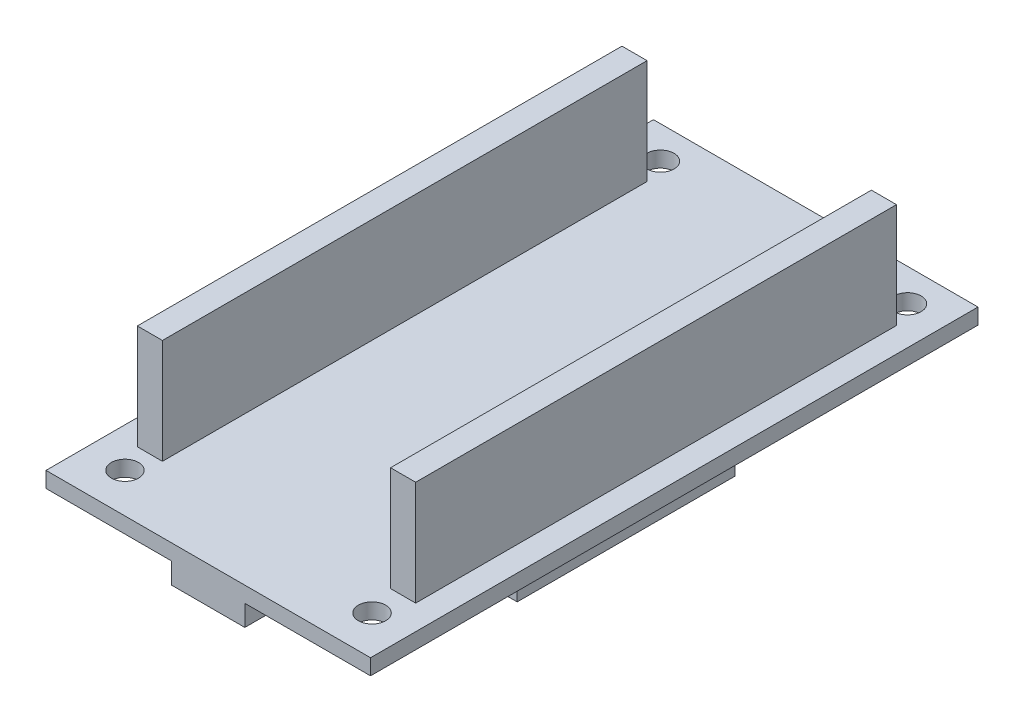
ISO-10303-21;
HEADER;
FILE_DESCRIPTION(('STEP AP214'),'2;1');
FILE_NAME('part.step','',(''),(''),'','','');
FILE_SCHEMA(('AUTOMOTIVE_DESIGN { 1 0 10303 214 1 1 1 1 }'));
ENDSEC;
DATA;
#1=APPLICATION_CONTEXT('core data for automotive mechanical design processes');
#2=APPLICATION_PROTOCOL_DEFINITION('international standard','automotive_design',2000,#1);
#3=PRODUCT_CONTEXT('',#1,'mechanical');
#4=PRODUCT('Part','Part','',(#3));
#5=PRODUCT_RELATED_PRODUCT_CATEGORY('part','',(#4));
#6=PRODUCT_DEFINITION_FORMATION('','',#4);
#7=PRODUCT_DEFINITION_CONTEXT('part definition',#1,'design');
#8=PRODUCT_DEFINITION('design','',#6,#7);
#9=PRODUCT_DEFINITION_SHAPE('','',#8);
#10=(LENGTH_UNIT() NAMED_UNIT(*) SI_UNIT(.MILLI.,.METRE.));
#11=(NAMED_UNIT(*) PLANE_ANGLE_UNIT() SI_UNIT($,.RADIAN.));
#12=(NAMED_UNIT(*) SI_UNIT($,.STERADIAN.) SOLID_ANGLE_UNIT());
#13=UNCERTAINTY_MEASURE_WITH_UNIT(LENGTH_MEASURE(1.E-05),#10,'distance_accuracy_value','');
#14=(GEOMETRIC_REPRESENTATION_CONTEXT(3) GLOBAL_UNCERTAINTY_ASSIGNED_CONTEXT((#13)) GLOBAL_UNIT_ASSIGNED_CONTEXT((#10,
#11,#12)) REPRESENTATION_CONTEXT('',''));
#15=CARTESIAN_POINT('',(0.,0.,0.));
#16=DIRECTION('',(0.,0.,1.));
#17=DIRECTION('',(1.,0.,0.));
#18=AXIS2_PLACEMENT_3D('',#15,#16,#17);
#19=CARTESIAN_POINT('',(0.,0.,0.));
#20=DIRECTION('',(0.,1.,0.));
#21=DIRECTION('',(0.,0.,1.));
#22=AXIS2_PLACEMENT_3D('',#19,#20,#21);
#23=PLANE('',#22);
#24=DIRECTION('',(0.,0.,-1.));
#25=VECTOR('',#24,1.);
#26=CARTESIAN_POINT('',(8.24109850979762,0.,3.777498206116));
#27=LINE('',#26,#25);
#28=CARTESIAN_POINT('',(8.24109850979762,0.,3.777498206116));
#29=VERTEX_POINT('',#28);
#30=CARTESIAN_POINT('',(8.24109850979762,0.,-3.62603920152593));
#31=VERTEX_POINT('',#30);
#32=EDGE_CURVE('E254',#29,#31,#27,.T.);
#33=ORIENTED_EDGE('',*,*,#32,.F.);
#34=DIRECTION('',(1.,0.,0.));
#35=VECTOR('',#34,1.);
#36=CARTESIAN_POINT('',(-3.76660419216143,0.,3.777498206116));
#37=LINE('',#36,#35);
#38=CARTESIAN_POINT('',(-3.76660419216143,0.,3.777498206116));
#39=VERTEX_POINT('',#38);
#40=EDGE_CURVE('E323',#39,#29,#37,.T.);
#41=ORIENTED_EDGE('',*,*,#40,.F.);
#42=DIRECTION('',(0.,0.,1.));
#43=VECTOR('',#42,1.);
#44=CARTESIAN_POINT('',(-3.76660419216143,0.,-54.248248197674));
#45=LINE('',#44,#43);
#46=CARTESIAN_POINT('',(-3.76660419216143,0.,-54.248248197674));
#47=VERTEX_POINT('',#46);
#48=EDGE_CURVE('E306',#47,#39,#45,.T.);
#49=ORIENTED_EDGE('',*,*,#48,.F.);
#50=DIRECTION('',(-1.,0.,0.));
#51=VECTOR('',#50,1.);
#52=CARTESIAN_POINT('',(-3.76660419216143,0.,-54.248248197674));
#53=LINE('',#52,#51);
#54=CARTESIAN_POINT('',(27.2346902260629,0.,-54.248248197674));
#55=VERTEX_POINT('',#54);
#56=EDGE_CURVE('E313',#55,#47,#53,.T.);
#57=ORIENTED_EDGE('',*,*,#56,.F.);
#58=DIRECTION('',(0.,0.,-1.));
#59=VECTOR('',#58,1.);
#60=CARTESIAN_POINT('',(27.2346902260629,0.,-54.248248197674));
#61=LINE('',#60,#59);
#62=CARTESIAN_POINT('',(27.2346902260629,0.,3.777498206116));
#63=VERTEX_POINT('',#62);
#64=EDGE_CURVE('E326',#63,#55,#61,.T.);
#65=ORIENTED_EDGE('',*,*,#64,.F.);
#66=CARTESIAN_POINT('',(15.2269875241038,0.,3.777498206116));
#67=VERTEX_POINT('',#66);
#68=EDGE_CURVE('E322',#67,#63,#37,.T.);
#69=ORIENTED_EDGE('',*,*,#68,.F.);
#70=DIRECTION('',(0.,0.,1.));
#71=VECTOR('',#70,1.);
#72=CARTESIAN_POINT('',(15.2269875241038,0.,3.777498206116));
#73=LINE('',#72,#71);
#74=CARTESIAN_POINT('',(15.2269875241038,0.,-3.62603920152593));
#75=VERTEX_POINT('',#74);
#76=EDGE_CURVE('E259',#75,#67,#73,.T.);
#77=ORIENTED_EDGE('',*,*,#76,.F.);
#78=DIRECTION('',(1.,0.,0.));
#79=VECTOR('',#78,1.);
#80=CARTESIAN_POINT('',(8.24109850979762,0.,-3.62603920152593));
#81=LINE('',#80,#79);
#82=EDGE_CURVE('E268',#31,#75,#81,.T.);
#83=ORIENTED_EDGE('',*,*,#82,.F.);
#84=EDGE_LOOP('',(#33,#41,#49,#57,#65,#69,#77,#83));
#85=FACE_BOUND('',#84,.T.);
#86=CARTESIAN_POINT('',(0.,0.,0.));
#87=DIRECTION('',(0.,1.,0.));
#88=DIRECTION('',(0.,0.,1.));
#89=AXIS2_PLACEMENT_3D('',#86,#87,#88);
#90=CIRCLE('',#89,1.3);
#91=CARTESIAN_POINT('',(0.,0.,1.3));
#92=VERTEX_POINT('',#91);
#93=EDGE_CURVE('E300',#92,#92,#90,.T.);
#94=ORIENTED_EDGE('',*,*,#93,.T.);
#95=EDGE_LOOP('',(#94));
#96=FACE_BOUND('',#95,.T.);
#97=CARTESIAN_POINT('',(23.6,0.,0.));
#98=DIRECTION('',(0.,1.,0.));
#99=DIRECTION('',(0.,0.,1.));
#100=AXIS2_PLACEMENT_3D('',#97,#98,#99);
#101=CIRCLE('',#100,1.3);
#102=CARTESIAN_POINT('',(23.6,0.,1.3));
#103=VERTEX_POINT('',#102);
#104=EDGE_CURVE('E294',#103,#103,#101,.T.);
#105=ORIENTED_EDGE('',*,*,#104,.T.);
#106=EDGE_LOOP('',(#105));
#107=FACE_BOUND('',#106,.T.);
#108=CARTESIAN_POINT('',(23.5999999999998,0.,-51.15));
#109=DIRECTION('',(0.,1.,0.));
#110=DIRECTION('',(0.,0.,1.));
#111=AXIS2_PLACEMENT_3D('',#108,#109,#110);
#112=CIRCLE('',#111,1.3);
#113=CARTESIAN_POINT('',(23.5999999999998,0.,-49.85));
#114=VERTEX_POINT('',#113);
#115=EDGE_CURVE('E288',#114,#114,#112,.T.);
#116=ORIENTED_EDGE('',*,*,#115,.T.);
#117=EDGE_LOOP('',(#116));
#118=FACE_BOUND('',#117,.T.);
#119=CARTESIAN_POINT('',(-1.75457236293007E-13,0.,-51.15));
#120=DIRECTION('',(0.,1.,0.));
#121=DIRECTION('',(0.,0.,1.));
#122=AXIS2_PLACEMENT_3D('',#119,#120,#121);
#123=CIRCLE('',#122,1.3);
#124=CARTESIAN_POINT('',(-1.75457236293007E-13,0.,-49.85));
#125=VERTEX_POINT('',#124);
#126=EDGE_CURVE('E284',#125,#125,#123,.T.);
#127=ORIENTED_EDGE('',*,*,#126,.T.);
#128=EDGE_LOOP('',(#127));
#129=FACE_BOUND('',#128,.T.);
#130=DIRECTION('',(0.,0.,1.));
#131=VECTOR('',#130,1.);
#132=CARTESIAN_POINT('',(26.1228890464172,0.,-11.3417972173268));
#133=LINE('',#132,#131);
#134=CARTESIAN_POINT('',(26.1228890464172,0.,-32.143063759925));
#135=VERTEX_POINT('',#134);
#136=CARTESIAN_POINT('',(26.1228890464172,0.,-11.3417972173268));
#137=VERTEX_POINT('',#136);
#138=EDGE_CURVE('E190',#135,#137,#133,.T.);
#139=ORIENTED_EDGE('',*,*,#138,.F.);
#140=DIRECTION('',(1.,0.,0.));
#141=VECTOR('',#140,1.);
#142=CARTESIAN_POINT('',(26.1228890464172,0.,-32.143063759925));
#143=LINE('',#142,#141);
#144=CARTESIAN_POINT('',(24.4546170430008,0.,-32.143063759925));
#145=VERTEX_POINT('',#144);
#146=EDGE_CURVE('E187',#145,#135,#143,.T.);
#147=ORIENTED_EDGE('',*,*,#146,.F.);
#148=DIRECTION('',(0.,0.,-1.));
#149=VECTOR('',#148,1.);
#150=CARTESIAN_POINT('',(24.4546170430008,0.,-11.3417972173268));
#151=LINE('',#150,#149);
#152=CARTESIAN_POINT('',(24.4546170430008,0.,-11.3417972173268));
#153=VERTEX_POINT('',#152);
#154=EDGE_CURVE('E53',#153,#145,#151,.T.);
#155=ORIENTED_EDGE('',*,*,#154,.F.);
#156=DIRECTION('',(-1.,0.,0.));
#157=VECTOR('',#156,1.);
#158=CARTESIAN_POINT('',(26.1228890464172,0.,-11.3417972173268));
#159=LINE('',#158,#157);
#160=EDGE_CURVE('E48',#137,#153,#159,.T.);
#161=ORIENTED_EDGE('',*,*,#160,.F.);
#162=EDGE_LOOP('',(#139,#147,#155,#161));
#163=FACE_BOUND('',#162,.T.);
#164=ADVANCED_FACE('F33',(#85,#96,#107,#118,#129,#163),#23,.F.);
#165=CARTESIAN_POINT('',(0.,1.5,0.));
#166=DIRECTION('',(0.,1.,0.));
#167=DIRECTION('',(0.,0.,1.));
#168=AXIS2_PLACEMENT_3D('',#165,#166,#167);
#169=PLANE('',#168);
#170=CARTESIAN_POINT('',(23.5999999999998,1.5,-51.15));
#171=DIRECTION('',(0.,1.,0.));
#172=DIRECTION('',(0.,0.,1.));
#173=AXIS2_PLACEMENT_3D('',#170,#171,#172);
#174=CIRCLE('',#173,1.3);
#175=CARTESIAN_POINT('',(23.5999999999998,1.5,-49.85));
#176=VERTEX_POINT('',#175);
#177=EDGE_CURVE('E291',#176,#176,#174,.T.);
#178=ORIENTED_EDGE('',*,*,#177,.F.);
#179=EDGE_LOOP('',(#178));
#180=FACE_BOUND('',#179,.T.);
#181=CARTESIAN_POINT('',(0.,1.5,0.));
#182=DIRECTION('',(0.,1.,0.));
#183=DIRECTION('',(0.,0.,1.));
#184=AXIS2_PLACEMENT_3D('',#181,#182,#183);
#185=CIRCLE('',#184,1.3);
#186=CARTESIAN_POINT('',(0.,1.5,1.3));
#187=VERTEX_POINT('',#186);
#188=EDGE_CURVE('E303',#187,#187,#185,.T.);
#189=ORIENTED_EDGE('',*,*,#188,.F.);
#190=EDGE_LOOP('',(#189));
#191=FACE_BOUND('',#190,.T.);
#192=DIRECTION('',(0.,0.,1.));
#193=VECTOR('',#192,1.);
#194=CARTESIAN_POINT('',(-3.76660419216143,1.5,-54.248248197674));
#195=LINE('',#194,#193);
#196=CARTESIAN_POINT('',(-3.76660419216143,1.5,-54.248248197674));
#197=VERTEX_POINT('',#196);
#198=CARTESIAN_POINT('',(-3.76660419216143,1.5,3.777498206116));
#199=VERTEX_POINT('',#198);
#200=EDGE_CURVE('E309',#197,#199,#195,.T.);
#201=ORIENTED_EDGE('',*,*,#200,.T.);
#202=DIRECTION('',(1.,0.,0.));
#203=VECTOR('',#202,1.);
#204=CARTESIAN_POINT('',(-3.76660419216143,1.5,3.777498206116));
#205=LINE('',#204,#203);
#206=CARTESIAN_POINT('',(27.2346902260629,1.5,3.777498206116));
#207=VERTEX_POINT('',#206);
#208=EDGE_CURVE('E312',#199,#207,#205,.T.);
#209=ORIENTED_EDGE('',*,*,#208,.T.);
#210=DIRECTION('',(0.,0.,-1.));
#211=VECTOR('',#210,1.);
#212=CARTESIAN_POINT('',(27.2346902260629,1.5,-54.248248197674));
#213=LINE('',#212,#211);
#214=CARTESIAN_POINT('',(27.2346902260629,1.5,-54.248248197674));
#215=VERTEX_POINT('',#214);
#216=EDGE_CURVE('E315',#207,#215,#213,.T.);
#217=ORIENTED_EDGE('',*,*,#216,.T.);
#218=DIRECTION('',(-1.,0.,0.));
#219=VECTOR('',#218,1.);
#220=CARTESIAN_POINT('',(-3.76660419216143,1.5,-54.248248197674));
#221=LINE('',#220,#219);
#222=EDGE_CURVE('E317',#215,#197,#221,.T.);
#223=ORIENTED_EDGE('',*,*,#222,.T.);
#224=EDGE_LOOP('',(#201,#209,#217,#223));
#225=FACE_BOUND('',#224,.T.);
#226=CARTESIAN_POINT('',(23.6,1.5,0.));
#227=DIRECTION('',(0.,1.,0.));
#228=DIRECTION('',(0.,0.,1.));
#229=AXIS2_PLACEMENT_3D('',#226,#227,#228);
#230=CIRCLE('',#229,1.3);
#231=CARTESIAN_POINT('',(23.6,1.5,1.3));
#232=VERTEX_POINT('',#231);
#233=EDGE_CURVE('E297',#232,#232,#230,.T.);
#234=ORIENTED_EDGE('',*,*,#233,.F.);
#235=EDGE_LOOP('',(#234));
#236=FACE_BOUND('',#235,.T.);
#237=CARTESIAN_POINT('',(-1.75457236293007E-13,1.5,-51.15));
#238=DIRECTION('',(0.,1.,0.));
#239=DIRECTION('',(0.,0.,1.));
#240=AXIS2_PLACEMENT_3D('',#237,#238,#239);
#241=CIRCLE('',#240,1.3);
#242=CARTESIAN_POINT('',(-1.75457236293007E-13,1.5,-49.85));
#243=VERTEX_POINT('',#242);
#244=EDGE_CURVE('E285',#243,#243,#241,.T.);
#245=ORIENTED_EDGE('',*,*,#244,.F.);
#246=EDGE_LOOP('',(#245));
#247=FACE_BOUND('',#246,.T.);
#248=DIRECTION('',(1.,0.,0.));
#249=VECTOR('',#248,1.);
#250=CARTESIAN_POINT('',(-1.35146550984669,1.5,-2.53123569928394));
#251=LINE('',#250,#249);
#252=CARTESIAN_POINT('',(-1.35146550984669,1.5,-2.53123569928394));
#253=VERTEX_POINT('',#252);
#254=CARTESIAN_POINT('',(1.04667549506438,1.5,-2.53123569928394));
#255=VERTEX_POINT('',#254);
#256=EDGE_CURVE('E239',#253,#255,#251,.T.);
#257=ORIENTED_EDGE('',*,*,#256,.F.);
#258=DIRECTION('',(0.,0.,1.));
#259=VECTOR('',#258,1.);
#260=CARTESIAN_POINT('',(-1.35146550984669,1.5,-48.8257837940891));
#261=LINE('',#260,#259);
#262=CARTESIAN_POINT('',(-1.35146550984669,1.5,-48.8257837940891));
#263=VERTEX_POINT('',#262);
#264=EDGE_CURVE('E225',#263,#253,#261,.T.);
#265=ORIENTED_EDGE('',*,*,#264,.F.);
#266=DIRECTION('',(-1.,0.,0.));
#267=VECTOR('',#266,1.);
#268=CARTESIAN_POINT('',(-1.35146550984669,1.5,-48.8257837940891));
#269=LINE('',#268,#267);
#270=CARTESIAN_POINT('',(1.04667549506438,1.5,-48.8257837940891));
#271=VERTEX_POINT('',#270);
#272=EDGE_CURVE('E230',#271,#263,#269,.T.);
#273=ORIENTED_EDGE('',*,*,#272,.F.);
#274=DIRECTION('',(0.,0.,-1.));
#275=VECTOR('',#274,1.);
#276=CARTESIAN_POINT('',(1.04667549506438,1.5,-48.8257837940891));
#277=LINE('',#276,#275);
#278=EDGE_CURVE('E241',#255,#271,#277,.T.);
#279=ORIENTED_EDGE('',*,*,#278,.F.);
#280=EDGE_LOOP('',(#257,#265,#273,#279));
#281=FACE_BOUND('',#280,.T.);
#282=DIRECTION('',(1.,0.,0.));
#283=VECTOR('',#282,1.);
#284=CARTESIAN_POINT('',(22.4735440389438,1.5,-2.89617020003128));
#285=LINE('',#284,#283);
#286=CARTESIAN_POINT('',(22.4735440389438,1.5,-2.89617020003128));
#287=VERTEX_POINT('',#286);
#288=CARTESIAN_POINT('',(24.8716850438549,1.5,-2.89617020003128));
#289=VERTEX_POINT('',#288);
#290=EDGE_CURVE('E194',#287,#289,#285,.T.);
#291=ORIENTED_EDGE('',*,*,#290,.F.);
#292=DIRECTION('',(0.,0.,1.));
#293=VECTOR('',#292,1.);
#294=CARTESIAN_POINT('',(22.4735440389438,1.5,-48.8257837940891));
#295=LINE('',#294,#293);
#296=CARTESIAN_POINT('',(22.4735440389438,1.5,-48.8257837940891));
#297=VERTEX_POINT('',#296);
#298=EDGE_CURVE('E191',#297,#287,#295,.T.);
#299=ORIENTED_EDGE('',*,*,#298,.F.);
#300=DIRECTION('',(-1.,0.,0.));
#301=VECTOR('',#300,1.);
#302=CARTESIAN_POINT('',(22.4735440389438,1.5,-48.8257837940891));
#303=LINE('',#302,#301);
#304=CARTESIAN_POINT('',(24.8716850438549,1.5,-48.8257837940891));
#305=VERTEX_POINT('',#304);
#306=EDGE_CURVE('E204',#305,#297,#303,.T.);
#307=ORIENTED_EDGE('',*,*,#306,.F.);
#308=DIRECTION('',(0.,0.,-1.));
#309=VECTOR('',#308,1.);
#310=CARTESIAN_POINT('',(24.8716850438549,1.5,-48.8257837940891));
#311=LINE('',#310,#309);
#312=EDGE_CURVE('E212',#289,#305,#311,.T.);
#313=ORIENTED_EDGE('',*,*,#312,.F.);
#314=EDGE_LOOP('',(#291,#299,#307,#313));
#315=FACE_BOUND('',#314,.T.);
#316=ADVANCED_FACE('F353',(#180,#191,#225,#236,#247,#281,#315),#169,.T.);
#317=CARTESIAN_POINT('',(-3.76660419216143,1.5,-54.248248197674));
#318=DIRECTION('',(1.,0.,0.));
#319=DIRECTION('',(0.,0.,-1.));
#320=AXIS2_PLACEMENT_3D('',#317,#318,#319);
#321=PLANE('',#320);
#322=ORIENTED_EDGE('',*,*,#48,.T.);
#323=DIRECTION('',(0.,-1.,0.));
#324=VECTOR('',#323,1.);
#325=CARTESIAN_POINT('',(-3.76660419216143,1.5,3.777498206116));
#326=LINE('',#325,#324);
#327=EDGE_CURVE('E11',#199,#39,#326,.T.);
#328=ORIENTED_EDGE('',*,*,#327,.F.);
#329=ORIENTED_EDGE('',*,*,#200,.F.);
#330=DIRECTION('',(0.,-1.,0.));
#331=VECTOR('',#330,1.);
#332=CARTESIAN_POINT('',(-3.76660419216143,1.5,-54.248248197674));
#333=LINE('',#332,#331);
#334=EDGE_CURVE('E319',#197,#47,#333,.T.);
#335=ORIENTED_EDGE('',*,*,#334,.T.);
#336=EDGE_LOOP('',(#322,#328,#329,#335));
#337=FACE_BOUND('',#336,.T.);
#338=ADVANCED_FACE('F35',(#337),#321,.F.);
#339=CARTESIAN_POINT('',(-3.76660419216143,1.5,3.777498206116));
#340=DIRECTION('',(0.,0.,-1.));
#341=DIRECTION('',(-1.,0.,0.));
#342=AXIS2_PLACEMENT_3D('',#339,#340,#341);
#343=PLANE('',#342);
#344=ORIENTED_EDGE('',*,*,#40,.T.);
#345=DIRECTION('',(0.,1.,0.));
#346=VECTOR('',#345,1.);
#347=CARTESIAN_POINT('',(8.24109850979762,-2.,3.777498206116));
#348=LINE('',#347,#346);
#349=CARTESIAN_POINT('',(8.24109850979762,-2.,3.777498206116));
#350=VERTEX_POINT('',#349);
#351=EDGE_CURVE('E265',#350,#29,#348,.T.);
#352=ORIENTED_EDGE('',*,*,#351,.F.);
#353=DIRECTION('',(-1.,0.,0.));
#354=VECTOR('',#353,1.);
#355=CARTESIAN_POINT('',(8.24109850979762,-2.,3.777498206116));
#356=LINE('',#355,#354);
#357=CARTESIAN_POINT('',(15.2269875241038,-2.,3.777498206116));
#358=VERTEX_POINT('',#357);
#359=EDGE_CURVE('E263',#358,#350,#356,.T.);
#360=ORIENTED_EDGE('',*,*,#359,.F.);
#361=DIRECTION('',(0.,1.,0.));
#362=VECTOR('',#361,1.);
#363=CARTESIAN_POINT('',(15.2269875241038,-2.,3.777498206116));
#364=LINE('',#363,#362);
#365=EDGE_CURVE('E275',#358,#67,#364,.T.);
#366=ORIENTED_EDGE('',*,*,#365,.T.);
#367=ORIENTED_EDGE('',*,*,#68,.T.);
#368=DIRECTION('',(0.,-1.,0.));
#369=VECTOR('',#368,1.);
#370=CARTESIAN_POINT('',(27.2346902260629,1.5,3.777498206116));
#371=LINE('',#370,#369);
#372=EDGE_CURVE('E41',#207,#63,#371,.T.);
#373=ORIENTED_EDGE('',*,*,#372,.F.);
#374=ORIENTED_EDGE('',*,*,#208,.F.);
#375=ORIENTED_EDGE('',*,*,#327,.T.);
#376=EDGE_LOOP('',(#344,#352,#360,#366,#367,#373,#374,#375));
#377=FACE_BOUND('',#376,.T.);
#378=ADVANCED_FACE('F355',(#377),#343,.F.);
#379=CARTESIAN_POINT('',(27.2346902260629,1.5,-54.248248197674));
#380=DIRECTION('',(-1.,0.,0.));
#381=DIRECTION('',(0.,0.,1.));
#382=AXIS2_PLACEMENT_3D('',#379,#380,#381);
#383=PLANE('',#382);
#384=ORIENTED_EDGE('',*,*,#64,.T.);
#385=DIRECTION('',(0.,-1.,0.));
#386=VECTOR('',#385,1.);
#387=CARTESIAN_POINT('',(27.2346902260629,1.5,-54.248248197674));
#388=LINE('',#387,#386);
#389=EDGE_CURVE('E331',#215,#55,#388,.T.);
#390=ORIENTED_EDGE('',*,*,#389,.F.);
#391=ORIENTED_EDGE('',*,*,#216,.F.);
#392=ORIENTED_EDGE('',*,*,#372,.T.);
#393=EDGE_LOOP('',(#384,#390,#391,#392));
#394=FACE_BOUND('',#393,.T.);
#395=ADVANCED_FACE('F338',(#394),#383,.F.);
#396=CARTESIAN_POINT('',(-3.76660419216143,1.5,-54.248248197674));
#397=DIRECTION('',(0.,0.,1.));
#398=DIRECTION('',(1.,0.,0.));
#399=AXIS2_PLACEMENT_3D('',#396,#397,#398);
#400=PLANE('',#399);
#401=ORIENTED_EDGE('',*,*,#56,.T.);
#402=ORIENTED_EDGE('',*,*,#334,.F.);
#403=ORIENTED_EDGE('',*,*,#222,.F.);
#404=ORIENTED_EDGE('',*,*,#389,.T.);
#405=EDGE_LOOP('',(#401,#402,#403,#404));
#406=FACE_BOUND('',#405,.T.);
#407=ADVANCED_FACE('F347',(#406),#400,.F.);
#408=CARTESIAN_POINT('',(0.,1.5,0.));
#409=DIRECTION('',(0.,-1.,0.));
#410=DIRECTION('',(0.,0.,-1.));
#411=AXIS2_PLACEMENT_3D('',#408,#409,#410);
#412=CYLINDRICAL_SURFACE('',#411,1.3);
#413=ORIENTED_EDGE('',*,*,#188,.T.);
#414=EDGE_LOOP('',(#413));
#415=FACE_BOUND('',#414,.T.);
#416=ORIENTED_EDGE('',*,*,#93,.F.);
#417=EDGE_LOOP('',(#416));
#418=FACE_BOUND('',#417,.T.);
#419=ADVANCED_FACE('F393',(#415,#418),#412,.F.);
#420=CARTESIAN_POINT('',(23.6,1.5,0.));
#421=DIRECTION('',(0.,-1.,0.));
#422=DIRECTION('',(0.,0.,-1.));
#423=AXIS2_PLACEMENT_3D('',#420,#421,#422);
#424=CYLINDRICAL_SURFACE('',#423,1.3);
#425=ORIENTED_EDGE('',*,*,#233,.T.);
#426=EDGE_LOOP('',(#425));
#427=FACE_BOUND('',#426,.T.);
#428=ORIENTED_EDGE('',*,*,#104,.F.);
#429=EDGE_LOOP('',(#428));
#430=FACE_BOUND('',#429,.T.);
#431=ADVANCED_FACE('F416',(#427,#430),#424,.F.);
#432=CARTESIAN_POINT('',(23.5999999999998,1.5,-51.15));
#433=DIRECTION('',(0.,-1.,0.));
#434=DIRECTION('',(0.,0.,-1.));
#435=AXIS2_PLACEMENT_3D('',#432,#433,#434);
#436=CYLINDRICAL_SURFACE('',#435,1.3);
#437=ORIENTED_EDGE('',*,*,#177,.T.);
#438=EDGE_LOOP('',(#437));
#439=FACE_BOUND('',#438,.T.);
#440=ORIENTED_EDGE('',*,*,#115,.F.);
#441=EDGE_LOOP('',(#440));
#442=FACE_BOUND('',#441,.T.);
#443=ADVANCED_FACE('F423',(#439,#442),#436,.F.);
#444=CARTESIAN_POINT('',(-1.75457236293007E-13,1.5,-51.15));
#445=DIRECTION('',(0.,-1.,0.));
#446=DIRECTION('',(0.,0.,-1.));
#447=AXIS2_PLACEMENT_3D('',#444,#445,#446);
#448=CYLINDRICAL_SURFACE('',#447,1.3);
#449=ORIENTED_EDGE('',*,*,#244,.T.);
#450=EDGE_LOOP('',(#449));
#451=FACE_BOUND('',#450,.T.);
#452=ORIENTED_EDGE('',*,*,#126,.F.);
#453=EDGE_LOOP('',(#452));
#454=FACE_BOUND('',#453,.T.);
#455=ADVANCED_FACE('F378',(#451,#454),#448,.F.);
#456=CARTESIAN_POINT('',(8.24109850979762,-2.,3.777498206116));
#457=DIRECTION('',(1.,0.,0.));
#458=DIRECTION('',(0.,0.,-1.));
#459=AXIS2_PLACEMENT_3D('',#456,#457,#458);
#460=PLANE('',#459);
#461=ORIENTED_EDGE('',*,*,#32,.T.);
#462=DIRECTION('',(0.,1.,0.));
#463=VECTOR('',#462,1.);
#464=CARTESIAN_POINT('',(8.24109850979762,-2.,-3.62603920152593));
#465=LINE('',#464,#463);
#466=CARTESIAN_POINT('',(8.24109850979762,-2.,-3.62603920152593));
#467=VERTEX_POINT('',#466);
#468=EDGE_CURVE('E281',#467,#31,#465,.T.);
#469=ORIENTED_EDGE('',*,*,#468,.F.);
#470=DIRECTION('',(0.,0.,-1.));
#471=VECTOR('',#470,1.);
#472=CARTESIAN_POINT('',(8.24109850979762,-2.,3.777498206116));
#473=LINE('',#472,#471);
#474=EDGE_CURVE('E255',#350,#467,#473,.T.);
#475=ORIENTED_EDGE('',*,*,#474,.F.);
#476=ORIENTED_EDGE('',*,*,#351,.T.);
#477=EDGE_LOOP('',(#461,#469,#475,#476));
#478=FACE_BOUND('',#477,.T.);
#479=ADVANCED_FACE('F360',(#478),#460,.F.);
#480=CARTESIAN_POINT('',(8.24109850979762,-2.,-3.62603920152593));
#481=DIRECTION('',(0.,0.,1.));
#482=DIRECTION('',(1.,0.,0.));
#483=AXIS2_PLACEMENT_3D('',#480,#481,#482);
#484=PLANE('',#483);
#485=ORIENTED_EDGE('',*,*,#82,.T.);
#486=DIRECTION('',(0.,1.,0.));
#487=VECTOR('',#486,1.);
#488=CARTESIAN_POINT('',(15.2269875241038,-2.,-3.62603920152593));
#489=LINE('',#488,#487);
#490=CARTESIAN_POINT('',(15.2269875241038,-2.,-3.62603920152593));
#491=VERTEX_POINT('',#490);
#492=EDGE_CURVE('E278',#491,#75,#489,.T.);
#493=ORIENTED_EDGE('',*,*,#492,.F.);
#494=DIRECTION('',(1.,0.,0.));
#495=VECTOR('',#494,1.);
#496=CARTESIAN_POINT('',(8.24109850979762,-2.,-3.62603920152593));
#497=LINE('',#496,#495);
#498=EDGE_CURVE('E258',#467,#491,#497,.T.);
#499=ORIENTED_EDGE('',*,*,#498,.F.);
#500=ORIENTED_EDGE('',*,*,#468,.T.);
#501=EDGE_LOOP('',(#485,#493,#499,#500));
#502=FACE_BOUND('',#501,.T.);
#503=ADVANCED_FACE('F370',(#502),#484,.F.);
#504=CARTESIAN_POINT('',(15.2269875241038,-2.,3.777498206116));
#505=DIRECTION('',(-1.,0.,0.));
#506=DIRECTION('',(0.,0.,1.));
#507=AXIS2_PLACEMENT_3D('',#504,#505,#506);
#508=PLANE('',#507);
#509=ORIENTED_EDGE('',*,*,#76,.T.);
#510=ORIENTED_EDGE('',*,*,#365,.F.);
#511=DIRECTION('',(0.,0.,1.));
#512=VECTOR('',#511,1.);
#513=CARTESIAN_POINT('',(15.2269875241038,-2.,3.777498206116));
#514=LINE('',#513,#512);
#515=EDGE_CURVE('E261',#491,#358,#514,.T.);
#516=ORIENTED_EDGE('',*,*,#515,.F.);
#517=ORIENTED_EDGE('',*,*,#492,.T.);
#518=EDGE_LOOP('',(#509,#510,#516,#517));
#519=FACE_BOUND('',#518,.T.);
#520=ADVANCED_FACE('F368',(#519),#508,.F.);
#521=CARTESIAN_POINT('',(0.,-2.,0.));
#522=DIRECTION('',(0.,-1.,0.));
#523=DIRECTION('',(0.,0.,-1.));
#524=AXIS2_PLACEMENT_3D('',#521,#522,#523);
#525=PLANE('',#524);
#526=ORIENTED_EDGE('',*,*,#474,.T.);
#527=ORIENTED_EDGE('',*,*,#498,.T.);
#528=ORIENTED_EDGE('',*,*,#515,.T.);
#529=ORIENTED_EDGE('',*,*,#359,.T.);
#530=EDGE_LOOP('',(#526,#527,#528,#529));
#531=FACE_BOUND('',#530,.T.);
#532=ADVANCED_FACE('F363',(#531),#525,.T.);
#533=CARTESIAN_POINT('',(-1.35146550984669,11.5,-48.8257837940891));
#534=DIRECTION('',(1.,0.,0.));
#535=DIRECTION('',(0.,0.,-1.));
#536=AXIS2_PLACEMENT_3D('',#533,#534,#535);
#537=PLANE('',#536);
#538=ORIENTED_EDGE('',*,*,#264,.T.);
#539=DIRECTION('',(0.,-1.,0.));
#540=VECTOR('',#539,1.);
#541=CARTESIAN_POINT('',(-1.35146550984669,11.5,-2.53123569928394));
#542=LINE('',#541,#540);
#543=CARTESIAN_POINT('',(-1.35146550984669,11.5,-2.53123569928394));
#544=VERTEX_POINT('',#543);
#545=EDGE_CURVE('E252',#544,#253,#542,.T.);
#546=ORIENTED_EDGE('',*,*,#545,.F.);
#547=DIRECTION('',(0.,0.,1.));
#548=VECTOR('',#547,1.);
#549=CARTESIAN_POINT('',(-1.35146550984669,11.5,-48.8257837940891));
#550=LINE('',#549,#548);
#551=CARTESIAN_POINT('',(-1.35146550984669,11.5,-48.8257837940891));
#552=VERTEX_POINT('',#551);
#553=EDGE_CURVE('E226',#552,#544,#550,.T.);
#554=ORIENTED_EDGE('',*,*,#553,.F.);
#555=DIRECTION('',(0.,-1.,0.));
#556=VECTOR('',#555,1.);
#557=CARTESIAN_POINT('',(-1.35146550984669,11.5,-48.8257837940891));
#558=LINE('',#557,#556);
#559=EDGE_CURVE('E236',#552,#263,#558,.T.);
#560=ORIENTED_EDGE('',*,*,#559,.T.);
#561=EDGE_LOOP('',(#538,#546,#554,#560));
#562=FACE_BOUND('',#561,.T.);
#563=ADVANCED_FACE('F453',(#562),#537,.F.);
#564=CARTESIAN_POINT('',(-1.35146550984669,11.5,-2.53123569928394));
#565=DIRECTION('',(0.,0.,-1.));
#566=DIRECTION('',(-1.,0.,0.));
#567=AXIS2_PLACEMENT_3D('',#564,#565,#566);
#568=PLANE('',#567);
#569=ORIENTED_EDGE('',*,*,#256,.T.);
#570=DIRECTION('',(0.,-1.,0.));
#571=VECTOR('',#570,1.);
#572=CARTESIAN_POINT('',(1.04667549506438,11.5,-2.53123569928394));
#573=LINE('',#572,#571);
#574=CARTESIAN_POINT('',(1.04667549506438,11.5,-2.53123569928394));
#575=VERTEX_POINT('',#574);
#576=EDGE_CURVE('E249',#575,#255,#573,.T.);
#577=ORIENTED_EDGE('',*,*,#576,.F.);
#578=DIRECTION('',(1.,0.,0.));
#579=VECTOR('',#578,1.);
#580=CARTESIAN_POINT('',(-1.35146550984669,11.5,-2.53123569928394));
#581=LINE('',#580,#579);
#582=EDGE_CURVE('E229',#544,#575,#581,.T.);
#583=ORIENTED_EDGE('',*,*,#582,.F.);
#584=ORIENTED_EDGE('',*,*,#545,.T.);
#585=EDGE_LOOP('',(#569,#577,#583,#584));
#586=FACE_BOUND('',#585,.T.);
#587=ADVANCED_FACE('F457',(#586),#568,.F.);
#588=CARTESIAN_POINT('',(1.04667549506438,11.5,-48.8257837940891));
#589=DIRECTION('',(-1.,0.,0.));
#590=DIRECTION('',(0.,0.,1.));
#591=AXIS2_PLACEMENT_3D('',#588,#589,#590);
#592=PLANE('',#591);
#593=ORIENTED_EDGE('',*,*,#278,.T.);
#594=DIRECTION('',(0.,-1.,0.));
#595=VECTOR('',#594,1.);
#596=CARTESIAN_POINT('',(1.04667549506438,11.5,-48.8257837940891));
#597=LINE('',#596,#595);
#598=CARTESIAN_POINT('',(1.04667549506438,11.5,-48.8257837940891));
#599=VERTEX_POINT('',#598);
#600=EDGE_CURVE('E247',#599,#271,#597,.T.);
#601=ORIENTED_EDGE('',*,*,#600,.F.);
#602=DIRECTION('',(0.,0.,-1.));
#603=VECTOR('',#602,1.);
#604=CARTESIAN_POINT('',(1.04667549506438,11.5,-48.8257837940891));
#605=LINE('',#604,#603);
#606=EDGE_CURVE('E232',#575,#599,#605,.T.);
#607=ORIENTED_EDGE('',*,*,#606,.F.);
#608=ORIENTED_EDGE('',*,*,#576,.T.);
#609=EDGE_LOOP('',(#593,#601,#607,#608));
#610=FACE_BOUND('',#609,.T.);
#611=ADVANCED_FACE('F467',(#610),#592,.F.);
#612=CARTESIAN_POINT('',(-1.35146550984669,11.5,-48.8257837940891));
#613=DIRECTION('',(0.,0.,1.));
#614=DIRECTION('',(1.,0.,0.));
#615=AXIS2_PLACEMENT_3D('',#612,#613,#614);
#616=PLANE('',#615);
#617=ORIENTED_EDGE('',*,*,#272,.T.);
#618=ORIENTED_EDGE('',*,*,#559,.F.);
#619=DIRECTION('',(-1.,0.,0.));
#620=VECTOR('',#619,1.);
#621=CARTESIAN_POINT('',(-1.35146550984669,11.5,-48.8257837940891));
#622=LINE('',#621,#620);
#623=EDGE_CURVE('E234',#599,#552,#622,.T.);
#624=ORIENTED_EDGE('',*,*,#623,.F.);
#625=ORIENTED_EDGE('',*,*,#600,.T.);
#626=EDGE_LOOP('',(#617,#618,#624,#625));
#627=FACE_BOUND('',#626,.T.);
#628=ADVANCED_FACE('F477',(#627),#616,.F.);
#629=CARTESIAN_POINT('',(0.,11.5,0.));
#630=DIRECTION('',(0.,1.,0.));
#631=DIRECTION('',(0.,0.,1.));
#632=AXIS2_PLACEMENT_3D('',#629,#630,#631);
#633=PLANE('',#632);
#634=ORIENTED_EDGE('',*,*,#553,.T.);
#635=ORIENTED_EDGE('',*,*,#582,.T.);
#636=ORIENTED_EDGE('',*,*,#606,.T.);
#637=ORIENTED_EDGE('',*,*,#623,.T.);
#638=EDGE_LOOP('',(#634,#635,#636,#637));
#639=FACE_BOUND('',#638,.T.);
#640=ADVANCED_FACE('F487',(#639),#633,.T.);
#641=CARTESIAN_POINT('',(22.4735440389438,11.5,-48.8257837940891));
#642=DIRECTION('',(1.,0.,0.));
#643=DIRECTION('',(0.,0.,-1.));
#644=AXIS2_PLACEMENT_3D('',#641,#642,#643);
#645=PLANE('',#644);
#646=ORIENTED_EDGE('',*,*,#298,.T.);
#647=DIRECTION('',(0.,-1.,0.));
#648=VECTOR('',#647,1.);
#649=CARTESIAN_POINT('',(22.4735440389438,11.5,-2.89617020003128));
#650=LINE('',#649,#648);
#651=CARTESIAN_POINT('',(22.4735440389438,11.5,-2.89617020003128));
#652=VERTEX_POINT('',#651);
#653=EDGE_CURVE('E223',#652,#287,#650,.T.);
#654=ORIENTED_EDGE('',*,*,#653,.F.);
#655=DIRECTION('',(0.,0.,1.));
#656=VECTOR('',#655,1.);
#657=CARTESIAN_POINT('',(22.4735440389438,11.5,-48.8257837940891));
#658=LINE('',#657,#656);
#659=CARTESIAN_POINT('',(22.4735440389438,11.5,-48.8257837940891));
#660=VERTEX_POINT('',#659);
#661=EDGE_CURVE('E200',#660,#652,#658,.T.);
#662=ORIENTED_EDGE('',*,*,#661,.F.);
#663=DIRECTION('',(0.,-1.,0.));
#664=VECTOR('',#663,1.);
#665=CARTESIAN_POINT('',(22.4735440389438,11.5,-48.8257837940891));
#666=LINE('',#665,#664);
#667=EDGE_CURVE('E209',#660,#297,#666,.T.);
#668=ORIENTED_EDGE('',*,*,#667,.T.);
#669=EDGE_LOOP('',(#646,#654,#662,#668));
#670=FACE_BOUND('',#669,.T.);
#671=ADVANCED_FACE('F497',(#670),#645,.F.);
#672=CARTESIAN_POINT('',(22.4735440389438,11.5,-2.89617020003128));
#673=DIRECTION('',(0.,0.,-1.));
#674=DIRECTION('',(-1.,0.,0.));
#675=AXIS2_PLACEMENT_3D('',#672,#673,#674);
#676=PLANE('',#675);
#677=ORIENTED_EDGE('',*,*,#290,.T.);
#678=DIRECTION('',(0.,-1.,0.));
#679=VECTOR('',#678,1.);
#680=CARTESIAN_POINT('',(24.8716850438549,11.5,-2.89617020003128));
#681=LINE('',#680,#679);
#682=CARTESIAN_POINT('',(24.8716850438549,11.5,-2.89617020003128));
#683=VERTEX_POINT('',#682);
#684=EDGE_CURVE('E220',#683,#289,#681,.T.);
#685=ORIENTED_EDGE('',*,*,#684,.F.);
#686=DIRECTION('',(1.,0.,0.));
#687=VECTOR('',#686,1.);
#688=CARTESIAN_POINT('',(22.4735440389438,11.5,-2.89617020003128));
#689=LINE('',#688,#687);
#690=EDGE_CURVE('E203',#652,#683,#689,.T.);
#691=ORIENTED_EDGE('',*,*,#690,.F.);
#692=ORIENTED_EDGE('',*,*,#653,.T.);
#693=EDGE_LOOP('',(#677,#685,#691,#692));
#694=FACE_BOUND('',#693,.T.);
#695=ADVANCED_FACE('F507',(#694),#676,.F.);
#696=CARTESIAN_POINT('',(24.8716850438549,11.5,-48.8257837940891));
#697=DIRECTION('',(-1.,0.,0.));
#698=DIRECTION('',(0.,0.,1.));
#699=AXIS2_PLACEMENT_3D('',#696,#697,#698);
#700=PLANE('',#699);
#701=ORIENTED_EDGE('',*,*,#312,.T.);
#702=DIRECTION('',(0.,-1.,0.));
#703=VECTOR('',#702,1.);
#704=CARTESIAN_POINT('',(24.8716850438549,11.5,-48.8257837940891));
#705=LINE('',#704,#703);
#706=CARTESIAN_POINT('',(24.8716850438549,11.5,-48.8257837940891));
#707=VERTEX_POINT('',#706);
#708=EDGE_CURVE('E218',#707,#305,#705,.T.);
#709=ORIENTED_EDGE('',*,*,#708,.F.);
#710=DIRECTION('',(0.,0.,-1.));
#711=VECTOR('',#710,1.);
#712=CARTESIAN_POINT('',(24.8716850438549,11.5,-48.8257837940891));
#713=LINE('',#712,#711);
#714=EDGE_CURVE('E206',#683,#707,#713,.T.);
#715=ORIENTED_EDGE('',*,*,#714,.F.);
#716=ORIENTED_EDGE('',*,*,#684,.T.);
#717=EDGE_LOOP('',(#701,#709,#715,#716));
#718=FACE_BOUND('',#717,.T.);
#719=ADVANCED_FACE('F517',(#718),#700,.F.);
#720=CARTESIAN_POINT('',(22.4735440389438,11.5,-48.8257837940891));
#721=DIRECTION('',(0.,0.,1.));
#722=DIRECTION('',(1.,0.,0.));
#723=AXIS2_PLACEMENT_3D('',#720,#721,#722);
#724=PLANE('',#723);
#725=ORIENTED_EDGE('',*,*,#306,.T.);
#726=ORIENTED_EDGE('',*,*,#667,.F.);
#727=DIRECTION('',(-1.,0.,0.));
#728=VECTOR('',#727,1.);
#729=CARTESIAN_POINT('',(22.4735440389438,11.5,-48.8257837940891));
#730=LINE('',#729,#728);
#731=EDGE_CURVE('E208',#707,#660,#730,.T.);
#732=ORIENTED_EDGE('',*,*,#731,.F.);
#733=ORIENTED_EDGE('',*,*,#708,.T.);
#734=EDGE_LOOP('',(#725,#726,#732,#733));
#735=FACE_BOUND('',#734,.T.);
#736=ADVANCED_FACE('F527',(#735),#724,.F.);
#737=CARTESIAN_POINT('',(0.,11.5,0.));
#738=DIRECTION('',(0.,1.,0.));
#739=DIRECTION('',(0.,0.,1.));
#740=AXIS2_PLACEMENT_3D('',#737,#738,#739);
#741=PLANE('',#740);
#742=ORIENTED_EDGE('',*,*,#661,.T.);
#743=ORIENTED_EDGE('',*,*,#690,.T.);
#744=ORIENTED_EDGE('',*,*,#714,.T.);
#745=ORIENTED_EDGE('',*,*,#731,.T.);
#746=EDGE_LOOP('',(#742,#743,#744,#745));
#747=FACE_BOUND('',#746,.T.);
#748=ADVANCED_FACE('F536',(#747),#741,.T.);
#749=CARTESIAN_POINT('',(26.1228890464172,-2.,-11.3417972173268));
#750=DIRECTION('',(-1.,0.,0.));
#751=DIRECTION('',(0.,0.,1.));
#752=AXIS2_PLACEMENT_3D('',#749,#750,#751);
#753=PLANE('',#752);
#754=ORIENTED_EDGE('',*,*,#138,.T.);
#755=DIRECTION('',(0.,1.,0.));
#756=VECTOR('',#755,1.);
#757=CARTESIAN_POINT('',(26.1228890464172,-2.,-11.3417972173268));
#758=LINE('',#757,#756);
#759=CARTESIAN_POINT('',(26.1228890464172,-2.,-11.3417972173268));
#760=VERTEX_POINT('',#759);
#761=EDGE_CURVE('E171',#760,#137,#758,.T.);
#762=ORIENTED_EDGE('',*,*,#761,.F.);
#763=DIRECTION('',(0.,0.,1.));
#764=VECTOR('',#763,1.);
#765=CARTESIAN_POINT('',(26.1228890464172,-2.,-11.3417972173268));
#766=LINE('',#765,#764);
#767=CARTESIAN_POINT('',(26.1228890464172,-2.,-32.143063759925));
#768=VERTEX_POINT('',#767);
#769=EDGE_CURVE('E178',#768,#760,#766,.T.);
#770=ORIENTED_EDGE('',*,*,#769,.F.);
#771=DIRECTION('',(0.,1.,0.));
#772=VECTOR('',#771,1.);
#773=CARTESIAN_POINT('',(26.1228890464172,-2.,-32.143063759925));
#774=LINE('',#773,#772);
#775=EDGE_CURVE('E639',#768,#135,#774,.T.);
#776=ORIENTED_EDGE('',*,*,#775,.T.);
#777=EDGE_LOOP('',(#754,#762,#770,#776));
#778=FACE_BOUND('',#777,.T.);
#779=ADVANCED_FACE('F189',(#778),#753,.F.);
#780=CARTESIAN_POINT('',(26.1228890464172,-2.,-11.3417972173268));
#781=DIRECTION('',(0.,0.,-1.));
#782=DIRECTION('',(-1.,0.,0.));
#783=AXIS2_PLACEMENT_3D('',#780,#781,#782);
#784=PLANE('',#783);
#785=ORIENTED_EDGE('',*,*,#160,.T.);
#786=DIRECTION('',(0.,1.,0.));
#787=VECTOR('',#786,1.);
#788=CARTESIAN_POINT('',(24.4546170430008,-2.,-11.3417972173268));
#789=LINE('',#788,#787);
#790=CARTESIAN_POINT('',(24.4546170430008,-2.,-11.3417972173268));
#791=VERTEX_POINT('',#790);
#792=EDGE_CURVE('E174',#791,#153,#789,.T.);
#793=ORIENTED_EDGE('',*,*,#792,.F.);
#794=DIRECTION('',(-1.,0.,0.));
#795=VECTOR('',#794,1.);
#796=CARTESIAN_POINT('',(26.1228890464172,-2.,-11.3417972173268));
#797=LINE('',#796,#795);
#798=EDGE_CURVE('E167',#760,#791,#797,.T.);
#799=ORIENTED_EDGE('',*,*,#798,.F.);
#800=ORIENTED_EDGE('',*,*,#761,.T.);
#801=EDGE_LOOP('',(#785,#793,#799,#800));
#802=FACE_BOUND('',#801,.T.);
#803=ADVANCED_FACE('F169',(#802),#784,.F.);
#804=CARTESIAN_POINT('',(24.4546170430008,-2.,-11.3417972173268));
#805=DIRECTION('',(1.,0.,0.));
#806=DIRECTION('',(0.,0.,-1.));
#807=AXIS2_PLACEMENT_3D('',#804,#805,#806);
#808=PLANE('',#807);
#809=ORIENTED_EDGE('',*,*,#154,.T.);
#810=DIRECTION('',(0.,1.,0.));
#811=VECTOR('',#810,1.);
#812=CARTESIAN_POINT('',(24.4546170430008,-2.,-32.143063759925));
#813=LINE('',#812,#811);
#814=CARTESIAN_POINT('',(24.4546170430008,-2.,-32.143063759925));
#815=VERTEX_POINT('',#814);
#816=EDGE_CURVE('E196',#815,#145,#813,.T.);
#817=ORIENTED_EDGE('',*,*,#816,.F.);
#818=DIRECTION('',(0.,0.,-1.));
#819=VECTOR('',#818,1.);
#820=CARTESIAN_POINT('',(24.4546170430008,-2.,-11.3417972173268));
#821=LINE('',#820,#819);
#822=EDGE_CURVE('E177',#791,#815,#821,.T.);
#823=ORIENTED_EDGE('',*,*,#822,.F.);
#824=ORIENTED_EDGE('',*,*,#792,.T.);
#825=EDGE_LOOP('',(#809,#817,#823,#824));
#826=FACE_BOUND('',#825,.T.);
#827=ADVANCED_FACE('F563',(#826),#808,.F.);
#828=CARTESIAN_POINT('',(26.1228890464172,-2.,-32.143063759925));
#829=DIRECTION('',(0.,0.,1.));
#830=DIRECTION('',(1.,0.,0.));
#831=AXIS2_PLACEMENT_3D('',#828,#829,#830);
#832=PLANE('',#831);
#833=ORIENTED_EDGE('',*,*,#146,.T.);
#834=ORIENTED_EDGE('',*,*,#775,.F.);
#835=DIRECTION('',(1.,0.,0.));
#836=VECTOR('',#835,1.);
#837=CARTESIAN_POINT('',(26.1228890464172,-2.,-32.143063759925));
#838=LINE('',#837,#836);
#839=EDGE_CURVE('E183',#815,#768,#838,.T.);
#840=ORIENTED_EDGE('',*,*,#839,.F.);
#841=ORIENTED_EDGE('',*,*,#816,.T.);
#842=EDGE_LOOP('',(#833,#834,#840,#841));
#843=FACE_BOUND('',#842,.T.);
#844=ADVANCED_FACE('F570',(#843),#832,.F.);
#845=CARTESIAN_POINT('',(0.,-2.,0.));
#846=DIRECTION('',(0.,1.,0.));
#847=DIRECTION('',(0.,0.,1.));
#848=AXIS2_PLACEMENT_3D('',#845,#846,#847);
#849=PLANE('',#848);
#850=ORIENTED_EDGE('',*,*,#769,.T.);
#851=ORIENTED_EDGE('',*,*,#798,.T.);
#852=ORIENTED_EDGE('',*,*,#822,.T.);
#853=ORIENTED_EDGE('',*,*,#839,.T.);
#854=EDGE_LOOP('',(#850,#851,#852,#853));
#855=FACE_BOUND('',#854,.T.);
#856=ADVANCED_FACE('F181',(#855),#849,.F.);
#857=CLOSED_SHELL('',(#164,#316,#338,#378,#395,#407,#419,#431,#443,#455,#479,#503,#520,#532,
#563,#587,#611,#628,#640,#671,#695,#719,#736,#748,#779,#803,#827,#844,#856));
#858=MANIFOLD_SOLID_BREP('B2',#857);
#859=ADVANCED_BREP_SHAPE_REPRESENTATION('',(#18,#858),#14);
#860=SHAPE_DEFINITION_REPRESENTATION(#9,#859);
ENDSEC;
END-ISO-10303-21;
